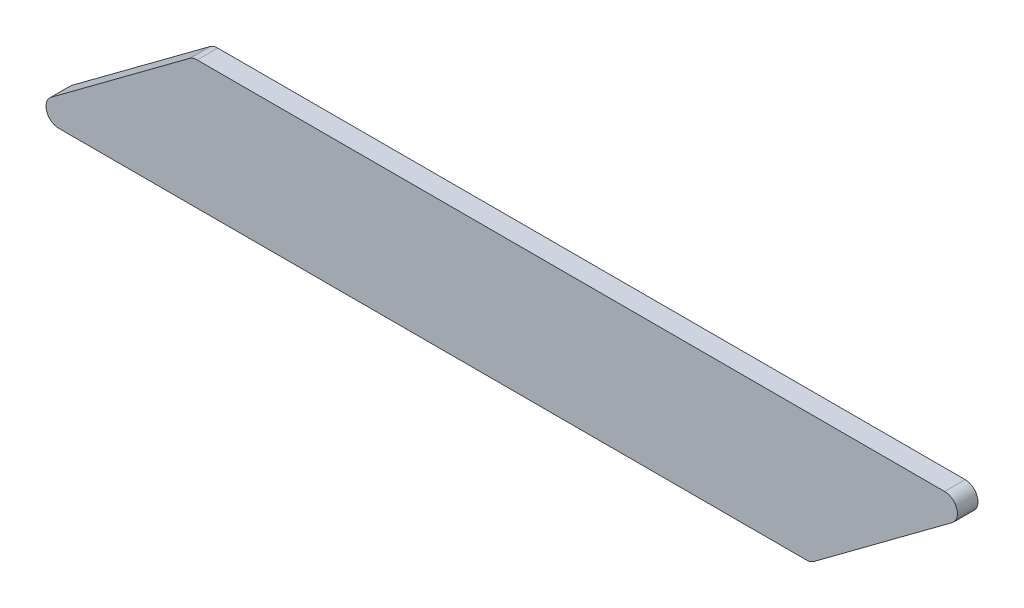
ISO-10303-21;
HEADER;
FILE_DESCRIPTION(('STEP AP214'),'2;1');
FILE_NAME('part.step','',(''),(''),'','','');
FILE_SCHEMA(('AUTOMOTIVE_DESIGN { 1 0 10303 214 1 1 1 1 }'));
ENDSEC;
DATA;
#1=APPLICATION_CONTEXT('core data for automotive mechanical design processes');
#2=APPLICATION_PROTOCOL_DEFINITION('international standard','automotive_design',2000,#1);
#3=PRODUCT_CONTEXT('',#1,'mechanical');
#4=PRODUCT('Part','Part','',(#3));
#5=PRODUCT_RELATED_PRODUCT_CATEGORY('part','',(#4));
#6=PRODUCT_DEFINITION_FORMATION('','',#4);
#7=PRODUCT_DEFINITION_CONTEXT('part definition',#1,'design');
#8=PRODUCT_DEFINITION('design','',#6,#7);
#9=PRODUCT_DEFINITION_SHAPE('','',#8);
#10=(LENGTH_UNIT() NAMED_UNIT(*) SI_UNIT(.MILLI.,.METRE.));
#11=(NAMED_UNIT(*) PLANE_ANGLE_UNIT() SI_UNIT($,.RADIAN.));
#12=(NAMED_UNIT(*) SI_UNIT($,.STERADIAN.) SOLID_ANGLE_UNIT());
#13=UNCERTAINTY_MEASURE_WITH_UNIT(LENGTH_MEASURE(1.E-05),#10,'distance_accuracy_value','');
#14=(GEOMETRIC_REPRESENTATION_CONTEXT(3) GLOBAL_UNCERTAINTY_ASSIGNED_CONTEXT((#13)) GLOBAL_UNIT_ASSIGNED_CONTEXT((#10,
#11,#12)) REPRESENTATION_CONTEXT('',''));
#15=CARTESIAN_POINT('',(0.,0.,0.));
#16=DIRECTION('',(0.,0.,1.));
#17=DIRECTION('',(1.,0.,0.));
#18=AXIS2_PLACEMENT_3D('',#15,#16,#17);
#19=CARTESIAN_POINT('',(-37.5,5.,1.6));
#20=DIRECTION('',(0.,-1.,0.));
#21=DIRECTION('',(0.,0.,-1.));
#22=AXIS2_PLACEMENT_3D('',#19,#20,#21);
#23=PLANE('',#22);
#24=DIRECTION('',(-1.,0.,0.));
#25=VECTOR('',#24,1.);
#26=CARTESIAN_POINT('',(-37.5,5.,1.6));
#27=LINE('',#26,#25);
#28=CARTESIAN_POINT('',(34.4781830415417,5.,1.6));
#29=VERTEX_POINT('',#28);
#30=CARTESIAN_POINT('',(-23.714622121459,5.,1.6));
#31=VERTEX_POINT('',#30);
#32=EDGE_CURVE('E156',#29,#31,#27,.T.);
#33=ORIENTED_EDGE('',*,*,#32,.F.);
#34=DIRECTION('',(0.,0.,-1.));
#35=VECTOR('',#34,1.);
#36=CARTESIAN_POINT('',(34.4781830415417,5.,0.));
#37=LINE('',#36,#35);
#38=CARTESIAN_POINT('',(34.4781830415417,5.,0.));
#39=VERTEX_POINT('',#38);
#40=EDGE_CURVE('E137',#29,#39,#37,.T.);
#41=ORIENTED_EDGE('',*,*,#40,.T.);
#42=DIRECTION('',(-1.,0.,0.));
#43=VECTOR('',#42,1.);
#44=CARTESIAN_POINT('',(-37.5,5.,0.));
#45=LINE('',#44,#43);
#46=CARTESIAN_POINT('',(-23.714622121459,5.,0.));
#47=VERTEX_POINT('',#46);
#48=EDGE_CURVE('E131',#39,#47,#45,.T.);
#49=ORIENTED_EDGE('',*,*,#48,.T.);
#50=DIRECTION('',(0.,0.,-1.));
#51=VECTOR('',#50,1.);
#52=CARTESIAN_POINT('',(-23.714622121459,5.,1.6));
#53=LINE('',#52,#51);
#54=EDGE_CURVE('E142',#47,#31,#53,.F.);
#55=ORIENTED_EDGE('',*,*,#54,.T.);
#56=EDGE_LOOP('',(#33,#41,#49,#55));
#57=FACE_BOUND('',#56,.T.);
#58=ADVANCED_FACE('F43',(#57),#23,.F.);
#59=CARTESIAN_POINT('',(-37.5,-5.,1.6));
#60=DIRECTION('',(0.,1.,0.));
#61=DIRECTION('',(0.,0.,1.));
#62=AXIS2_PLACEMENT_3D('',#59,#60,#61);
#63=PLANE('',#62);
#64=DIRECTION('',(1.,0.,0.));
#65=VECTOR('',#64,1.);
#66=CARTESIAN_POINT('',(-37.5,-5.,0.));
#67=LINE('',#66,#65);
#68=CARTESIAN_POINT('',(-34.4781830415417,-5.,0.));
#69=VERTEX_POINT('',#68);
#70=CARTESIAN_POINT('',(23.714622121459,-5.,0.));
#71=VERTEX_POINT('',#70);
#72=EDGE_CURVE('E163',#69,#71,#67,.T.);
#73=ORIENTED_EDGE('',*,*,#72,.T.);
#74=DIRECTION('',(0.,0.,-1.));
#75=VECTOR('',#74,1.);
#76=CARTESIAN_POINT('',(23.714622121459,-5.,1.6));
#77=LINE('',#76,#75);
#78=CARTESIAN_POINT('',(23.714622121459,-5.,1.6));
#79=VERTEX_POINT('',#78);
#80=EDGE_CURVE('E193',#71,#79,#77,.F.);
#81=ORIENTED_EDGE('',*,*,#80,.T.);
#82=DIRECTION('',(1.,0.,0.));
#83=VECTOR('',#82,1.);
#84=CARTESIAN_POINT('',(-37.5,-5.,1.6));
#85=LINE('',#84,#83);
#86=CARTESIAN_POINT('',(-34.4781830415417,-5.,1.6));
#87=VERTEX_POINT('',#86);
#88=EDGE_CURVE('E169',#87,#79,#85,.T.);
#89=ORIENTED_EDGE('',*,*,#88,.F.);
#90=DIRECTION('',(0.,0.,-1.));
#91=VECTOR('',#90,1.);
#92=CARTESIAN_POINT('',(-34.4781830415417,-5.,0.));
#93=LINE('',#92,#91);
#94=EDGE_CURVE('E189',#87,#69,#93,.T.);
#95=ORIENTED_EDGE('',*,*,#94,.T.);
#96=EDGE_LOOP('',(#73,#81,#89,#95));
#97=FACE_BOUND('',#96,.T.);
#98=ADVANCED_FACE('F201',(#97),#63,.F.);
#99=CARTESIAN_POINT('',(0.,0.,1.6));
#100=DIRECTION('',(0.,0.,-1.));
#101=DIRECTION('',(-1.,0.,0.));
#102=AXIS2_PLACEMENT_3D('',#99,#100,#101);
#103=PLANE('',#102);
#104=ORIENTED_EDGE('',*,*,#88,.T.);
#105=CARTESIAN_POINT('',(23.714622121459,-4.,1.6));
#106=DIRECTION('',(0.,0.,-1.));
#107=DIRECTION('',(-1.,0.,0.));
#108=AXIS2_PLACEMENT_3D('',#105,#106,#107);
#109=CIRCLE('',#108,1.);
#110=CARTESIAN_POINT('',(24.3111484851703,-4.80259348203022,1.6));
#111=VERTEX_POINT('',#110);
#112=EDGE_CURVE('E129',#79,#111,#109,.F.);
#113=ORIENTED_EDGE('',*,*,#112,.T.);
#114=DIRECTION('',(-0.802593482030221,-0.596526363711282,0.));
#115=VECTOR('',#114,1.);
#116=CARTESIAN_POINT('',(10.9502979907284,-14.7330249395329,1.6));
#117=LINE('',#116,#115);
#118=CARTESIAN_POINT('',(35.074709405253,3.19740651796978,1.6));
#119=VERTEX_POINT('',#118);
#120=EDGE_CURVE('E115',#119,#111,#117,.T.);
#121=ORIENTED_EDGE('',*,*,#120,.F.);
#122=CARTESIAN_POINT('',(34.4781830415417,4.,1.6));
#123=DIRECTION('',(0.,0.,-1.));
#124=DIRECTION('',(-1.,0.,0.));
#125=AXIS2_PLACEMENT_3D('',#122,#123,#124);
#126=CIRCLE('',#125,1.);
#127=EDGE_CURVE('E126',#119,#29,#126,.F.);
#128=ORIENTED_EDGE('',*,*,#127,.T.);
#129=ORIENTED_EDGE('',*,*,#32,.T.);
#130=CARTESIAN_POINT('',(-23.714622121459,4.,1.6));
#131=DIRECTION('',(0.,0.,-1.));
#132=DIRECTION('',(-1.,0.,0.));
#133=AXIS2_PLACEMENT_3D('',#130,#131,#132);
#134=CIRCLE('',#133,1.);
#135=CARTESIAN_POINT('',(-24.3111484851703,4.80259348203022,1.6));
#136=VERTEX_POINT('',#135);
#137=EDGE_CURVE('E59',#31,#136,#134,.F.);
#138=ORIENTED_EDGE('',*,*,#137,.T.);
#139=DIRECTION('',(0.802593482030221,0.596526363711282,0.));
#140=VECTOR('',#139,1.);
#141=CARTESIAN_POINT('',(-10.9502979907284,14.7330249395329,1.6));
#142=LINE('',#141,#140);
#143=CARTESIAN_POINT('',(-35.074709405253,-3.19740651796978,1.6));
#144=VERTEX_POINT('',#143);
#145=EDGE_CURVE('E132',#144,#136,#142,.T.);
#146=ORIENTED_EDGE('',*,*,#145,.F.);
#147=CARTESIAN_POINT('',(-34.4781830415417,-4.,1.6));
#148=DIRECTION('',(0.,0.,-1.));
#149=DIRECTION('',(-1.,0.,0.));
#150=AXIS2_PLACEMENT_3D('',#147,#148,#149);
#151=CIRCLE('',#150,1.);
#152=EDGE_CURVE('E144',#144,#87,#151,.F.);
#153=ORIENTED_EDGE('',*,*,#152,.T.);
#154=EDGE_LOOP('',(#104,#113,#121,#128,#129,#138,#146,#153));
#155=FACE_BOUND('',#154,.T.);
#156=ADVANCED_FACE('F125',(#155),#103,.F.);
#157=CARTESIAN_POINT('',(0.,0.,0.));
#158=DIRECTION('',(0.,0.,-1.));
#159=DIRECTION('',(-1.,0.,0.));
#160=AXIS2_PLACEMENT_3D('',#157,#158,#159);
#161=PLANE('',#160);
#162=DIRECTION('',(-0.802593482030221,-0.596526363711282,0.));
#163=VECTOR('',#162,1.);
#164=CARTESIAN_POINT('',(10.9502979907284,-14.7330249395329,0.));
#165=LINE('',#164,#163);
#166=CARTESIAN_POINT('',(35.074709405253,3.19740651796978,0.));
#167=VERTEX_POINT('',#166);
#168=CARTESIAN_POINT('',(24.3111484851703,-4.80259348203022,0.));
#169=VERTEX_POINT('',#168);
#170=EDGE_CURVE('E118',#167,#169,#165,.T.);
#171=ORIENTED_EDGE('',*,*,#170,.T.);
#172=CARTESIAN_POINT('',(23.714622121459,-4.,0.));
#173=DIRECTION('',(0.,0.,-1.));
#174=DIRECTION('',(-1.,0.,0.));
#175=AXIS2_PLACEMENT_3D('',#172,#173,#174);
#176=CIRCLE('',#175,1.);
#177=EDGE_CURVE('E186',#169,#71,#176,.T.);
#178=ORIENTED_EDGE('',*,*,#177,.T.);
#179=ORIENTED_EDGE('',*,*,#72,.F.);
#180=CARTESIAN_POINT('',(-34.4781830415417,-4.,0.));
#181=DIRECTION('',(0.,0.,-1.));
#182=DIRECTION('',(-1.,0.,0.));
#183=AXIS2_PLACEMENT_3D('',#180,#181,#182);
#184=CIRCLE('',#183,1.);
#185=CARTESIAN_POINT('',(-35.074709405253,-3.19740651796978,0.));
#186=VERTEX_POINT('',#185);
#187=EDGE_CURVE('E179',#69,#186,#184,.T.);
#188=ORIENTED_EDGE('',*,*,#187,.T.);
#189=DIRECTION('',(0.802593482030221,0.596526363711282,0.));
#190=VECTOR('',#189,1.);
#191=CARTESIAN_POINT('',(-10.9502979907284,14.7330249395329,0.));
#192=LINE('',#191,#190);
#193=CARTESIAN_POINT('',(-24.3111484851703,4.80259348203022,0.));
#194=VERTEX_POINT('',#193);
#195=EDGE_CURVE('E172',#186,#194,#192,.T.);
#196=ORIENTED_EDGE('',*,*,#195,.T.);
#197=CARTESIAN_POINT('',(-23.714622121459,4.,0.));
#198=DIRECTION('',(0.,0.,-1.));
#199=DIRECTION('',(-1.,0.,0.));
#200=AXIS2_PLACEMENT_3D('',#197,#198,#199);
#201=CIRCLE('',#200,1.);
#202=EDGE_CURVE('E161',#194,#47,#201,.T.);
#203=ORIENTED_EDGE('',*,*,#202,.T.);
#204=ORIENTED_EDGE('',*,*,#48,.F.);
#205=CARTESIAN_POINT('',(34.4781830415417,4.,0.));
#206=DIRECTION('',(0.,0.,-1.));
#207=DIRECTION('',(-1.,0.,0.));
#208=AXIS2_PLACEMENT_3D('',#205,#206,#207);
#209=CIRCLE('',#208,1.);
#210=EDGE_CURVE('E159',#39,#167,#209,.T.);
#211=ORIENTED_EDGE('',*,*,#210,.T.);
#212=EDGE_LOOP('',(#171,#178,#179,#188,#196,#203,#204,#211));
#213=FACE_BOUND('',#212,.T.);
#214=ADVANCED_FACE('F158',(#213),#161,.T.);
#215=CARTESIAN_POINT('',(-10.9502979907284,14.7330249395329,1.600012));
#216=DIRECTION('',(-0.596526363711282,0.802593482030221,0.));
#217=DIRECTION('',(-0.802593482030221,-0.596526363711282,0.));
#218=AXIS2_PLACEMENT_3D('',#215,#216,#217);
#219=PLANE('',#218);
#220=ORIENTED_EDGE('',*,*,#145,.T.);
#221=DIRECTION('',(0.,0.,-1.));
#222=VECTOR('',#221,1.);
#223=CARTESIAN_POINT('',(-24.3111484851703,4.80259348203022,0.));
#224=LINE('',#223,#222);
#225=EDGE_CURVE('E11',#136,#194,#224,.T.);
#226=ORIENTED_EDGE('',*,*,#225,.T.);
#227=ORIENTED_EDGE('',*,*,#195,.F.);
#228=DIRECTION('',(0.,0.,-1.));
#229=VECTOR('',#228,1.);
#230=CARTESIAN_POINT('',(-35.074709405253,-3.19740651796978,1.6));
#231=LINE('',#230,#229);
#232=EDGE_CURVE('E52',#186,#144,#231,.F.);
#233=ORIENTED_EDGE('',*,*,#232,.T.);
#234=EDGE_LOOP('',(#220,#226,#227,#233));
#235=FACE_BOUND('',#234,.T.);
#236=ADVANCED_FACE('F205',(#235),#219,.T.);
#237=CARTESIAN_POINT('',(10.9502979907284,-14.7330249395329,1.600012));
#238=DIRECTION('',(0.596526363711282,-0.802593482030221,0.));
#239=DIRECTION('',(0.802593482030221,0.596526363711282,0.));
#240=AXIS2_PLACEMENT_3D('',#237,#238,#239);
#241=PLANE('',#240);
#242=ORIENTED_EDGE('',*,*,#120,.T.);
#243=DIRECTION('',(0.,0.,-1.));
#244=VECTOR('',#243,1.);
#245=CARTESIAN_POINT('',(24.3111484851703,-4.80259348203022,0.));
#246=LINE('',#245,#244);
#247=EDGE_CURVE('E122',#111,#169,#246,.T.);
#248=ORIENTED_EDGE('',*,*,#247,.T.);
#249=ORIENTED_EDGE('',*,*,#170,.F.);
#250=DIRECTION('',(0.,0.,-1.));
#251=VECTOR('',#250,1.);
#252=CARTESIAN_POINT('',(35.074709405253,3.19740651796978,1.6));
#253=LINE('',#252,#251);
#254=EDGE_CURVE('E111',#167,#119,#253,.F.);
#255=ORIENTED_EDGE('',*,*,#254,.T.);
#256=EDGE_LOOP('',(#242,#248,#249,#255));
#257=FACE_BOUND('',#256,.T.);
#258=ADVANCED_FACE('F113',(#257),#241,.T.);
#259=CARTESIAN_POINT('',(23.714622121459,-4.,1.600012));
#260=DIRECTION('',(0.,0.,1.));
#261=DIRECTION('',(1.,0.,0.));
#262=AXIS2_PLACEMENT_3D('',#259,#260,#261);
#263=CYLINDRICAL_SURFACE('',#262,1.);
#264=ORIENTED_EDGE('',*,*,#112,.F.);
#265=ORIENTED_EDGE('',*,*,#80,.F.);
#266=ORIENTED_EDGE('',*,*,#177,.F.);
#267=ORIENTED_EDGE('',*,*,#247,.F.);
#268=EDGE_LOOP('',(#264,#265,#266,#267));
#269=FACE_BOUND('',#268,.T.);
#270=ADVANCED_FACE('F217',(#269),#263,.T.);
#271=CARTESIAN_POINT('',(34.4781830415417,4.,1.6));
#272=DIRECTION('',(0.,0.,1.));
#273=DIRECTION('',(1.,0.,0.));
#274=AXIS2_PLACEMENT_3D('',#271,#272,#273);
#275=CYLINDRICAL_SURFACE('',#274,1.);
#276=ORIENTED_EDGE('',*,*,#127,.F.);
#277=ORIENTED_EDGE('',*,*,#254,.F.);
#278=ORIENTED_EDGE('',*,*,#210,.F.);
#279=ORIENTED_EDGE('',*,*,#40,.F.);
#280=EDGE_LOOP('',(#276,#277,#278,#279));
#281=FACE_BOUND('',#280,.T.);
#282=ADVANCED_FACE('F135',(#281),#275,.T.);
#283=CARTESIAN_POINT('',(-23.714622121459,4.,1.600012));
#284=DIRECTION('',(0.,0.,1.));
#285=DIRECTION('',(1.,0.,0.));
#286=AXIS2_PLACEMENT_3D('',#283,#284,#285);
#287=CYLINDRICAL_SURFACE('',#286,1.);
#288=ORIENTED_EDGE('',*,*,#137,.F.);
#289=ORIENTED_EDGE('',*,*,#54,.F.);
#290=ORIENTED_EDGE('',*,*,#202,.F.);
#291=ORIENTED_EDGE('',*,*,#225,.F.);
#292=EDGE_LOOP('',(#288,#289,#290,#291));
#293=FACE_BOUND('',#292,.T.);
#294=ADVANCED_FACE('F208',(#293),#287,.T.);
#295=CARTESIAN_POINT('',(-34.4781830415417,-4.,1.6));
#296=DIRECTION('',(0.,0.,1.));
#297=DIRECTION('',(1.,0.,0.));
#298=AXIS2_PLACEMENT_3D('',#295,#296,#297);
#299=CYLINDRICAL_SURFACE('',#298,1.);
#300=ORIENTED_EDGE('',*,*,#152,.F.);
#301=ORIENTED_EDGE('',*,*,#232,.F.);
#302=ORIENTED_EDGE('',*,*,#187,.F.);
#303=ORIENTED_EDGE('',*,*,#94,.F.);
#304=EDGE_LOOP('',(#300,#301,#302,#303));
#305=FACE_BOUND('',#304,.T.);
#306=ADVANCED_FACE('F45',(#305),#299,.T.);
#307=CLOSED_SHELL('',(#58,#98,#156,#214,#236,#258,#270,#282,#294,#306));
#308=MANIFOLD_SOLID_BREP('B2',#307);
#309=ADVANCED_BREP_SHAPE_REPRESENTATION('',(#18,#308),#14);
#310=SHAPE_DEFINITION_REPRESENTATION(#9,#309);
ENDSEC;
END-ISO-10303-21;
